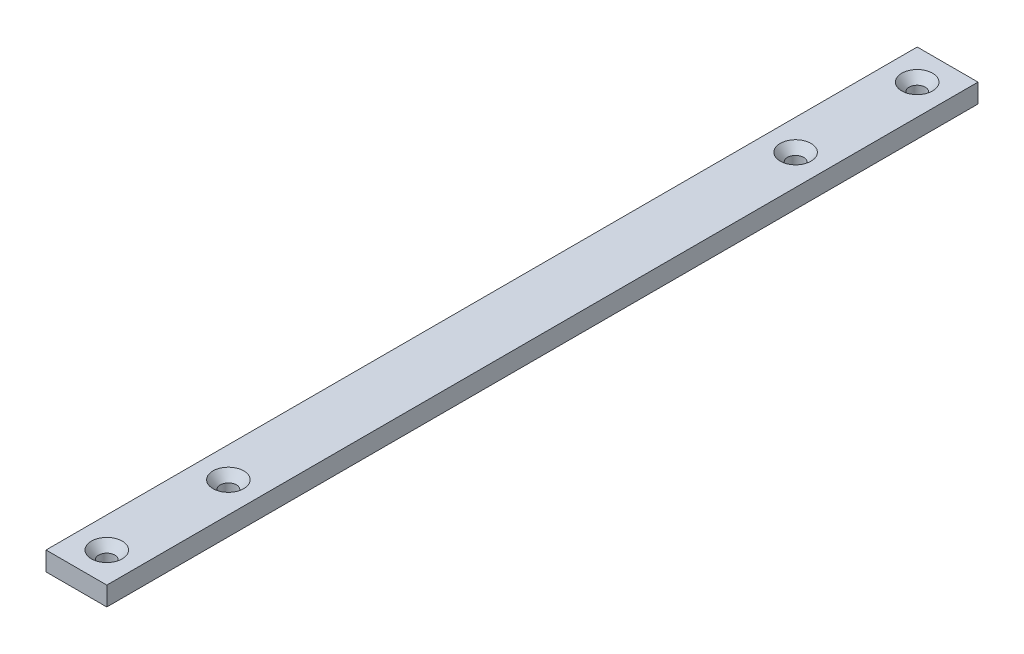
ISO-10303-21;
HEADER;
FILE_DESCRIPTION(('STEP AP214'),'2;1');
FILE_NAME('part.step','',(''),(''),'','','');
FILE_SCHEMA(('AUTOMOTIVE_DESIGN { 1 0 10303 214 1 1 1 1 }'));
ENDSEC;
DATA;
#1=APPLICATION_CONTEXT('core data for automotive mechanical design processes');
#2=APPLICATION_PROTOCOL_DEFINITION('international standard','automotive_design',2000,#1);
#3=PRODUCT_CONTEXT('',#1,'mechanical');
#4=PRODUCT('Part','Part','',(#3));
#5=PRODUCT_RELATED_PRODUCT_CATEGORY('part','',(#4));
#6=PRODUCT_DEFINITION_FORMATION('','',#4);
#7=PRODUCT_DEFINITION_CONTEXT('part definition',#1,'design');
#8=PRODUCT_DEFINITION('design','',#6,#7);
#9=PRODUCT_DEFINITION_SHAPE('','',#8);
#10=(LENGTH_UNIT() NAMED_UNIT(*) SI_UNIT(.MILLI.,.METRE.));
#11=(NAMED_UNIT(*) PLANE_ANGLE_UNIT() SI_UNIT($,.RADIAN.));
#12=(NAMED_UNIT(*) SI_UNIT($,.STERADIAN.) SOLID_ANGLE_UNIT());
#13=UNCERTAINTY_MEASURE_WITH_UNIT(LENGTH_MEASURE(1.E-05),#10,'distance_accuracy_value','');
#14=(GEOMETRIC_REPRESENTATION_CONTEXT(3) GLOBAL_UNCERTAINTY_ASSIGNED_CONTEXT((#13)) GLOBAL_UNIT_ASSIGNED_CONTEXT((#10,
#11,#12)) REPRESENTATION_CONTEXT('',''));
#15=CARTESIAN_POINT('',(0.,0.,0.));
#16=DIRECTION('',(0.,0.,1.));
#17=DIRECTION('',(1.,0.,0.));
#18=AXIS2_PLACEMENT_3D('',#15,#16,#17);
#19=CARTESIAN_POINT('',(-12.7,3.96875,182.));
#20=DIRECTION('',(1.,0.,0.));
#21=DIRECTION('',(0.,0.,-1.));
#22=AXIS2_PLACEMENT_3D('',#19,#20,#21);
#23=PLANE('',#22);
#24=DIRECTION('',(0.,-1.,0.));
#25=VECTOR('',#24,1.);
#26=CARTESIAN_POINT('',(-12.7,3.96875,-182.));
#27=LINE('',#26,#25);
#28=CARTESIAN_POINT('',(-12.7,3.96875,-182.));
#29=VERTEX_POINT('',#28);
#30=CARTESIAN_POINT('',(-12.7,-3.96875,-182.));
#31=VERTEX_POINT('',#30);
#32=EDGE_CURVE('E100',#29,#31,#27,.T.);
#33=ORIENTED_EDGE('',*,*,#32,.T.);
#34=DIRECTION('',(0.,0.,-1.));
#35=VECTOR('',#34,1.);
#36=CARTESIAN_POINT('',(-12.7,-3.96875,182.));
#37=LINE('',#36,#35);
#38=CARTESIAN_POINT('',(-12.7,-3.96875,182.));
#39=VERTEX_POINT('',#38);
#40=EDGE_CURVE('E11',#39,#31,#37,.T.);
#41=ORIENTED_EDGE('',*,*,#40,.F.);
#42=DIRECTION('',(0.,-1.,0.));
#43=VECTOR('',#42,1.);
#44=CARTESIAN_POINT('',(-12.7,3.96875,182.));
#45=LINE('',#44,#43);
#46=CARTESIAN_POINT('',(-12.7,3.96875,182.));
#47=VERTEX_POINT('',#46);
#48=EDGE_CURVE('E88',#47,#39,#45,.T.);
#49=ORIENTED_EDGE('',*,*,#48,.F.);
#50=DIRECTION('',(0.,0.,-1.));
#51=VECTOR('',#50,1.);
#52=CARTESIAN_POINT('',(-12.7,3.96875,182.));
#53=LINE('',#52,#51);
#54=EDGE_CURVE('E96',#47,#29,#53,.T.);
#55=ORIENTED_EDGE('',*,*,#54,.T.);
#56=EDGE_LOOP('',(#33,#41,#49,#55));
#57=FACE_BOUND('',#56,.T.);
#58=ADVANCED_FACE('F37',(#57),#23,.F.);
#59=CARTESIAN_POINT('',(12.7,-3.96875,182.));
#60=DIRECTION('',(0.,1.,0.));
#61=DIRECTION('',(0.,0.,1.));
#62=AXIS2_PLACEMENT_3D('',#59,#60,#61);
#63=PLANE('',#62);
#64=CARTESIAN_POINT('',(0.,-3.96875,-169.3));
#65=DIRECTION('',(0.,1.,0.));
#66=DIRECTION('',(0.,0.,1.));
#67=AXIS2_PLACEMENT_3D('',#64,#65,#66);
#68=CIRCLE('',#67,3.3782);
#69=CARTESIAN_POINT('',(0.,-3.96875,-165.9218));
#70=VERTEX_POINT('',#69);
#71=EDGE_CURVE('E140',#70,#70,#68,.T.);
#72=ORIENTED_EDGE('',*,*,#71,.T.);
#73=EDGE_LOOP('',(#72));
#74=FACE_BOUND('',#73,.T.);
#75=CARTESIAN_POINT('',(0.,-3.96875,169.3));
#76=DIRECTION('',(0.,1.,0.));
#77=DIRECTION('',(0.,0.,1.));
#78=AXIS2_PLACEMENT_3D('',#75,#76,#77);
#79=CIRCLE('',#78,3.3782);
#80=CARTESIAN_POINT('',(0.,-3.96875,172.6782));
#81=VERTEX_POINT('',#80);
#82=EDGE_CURVE('E131',#81,#81,#79,.T.);
#83=ORIENTED_EDGE('',*,*,#82,.T.);
#84=EDGE_LOOP('',(#83));
#85=FACE_BOUND('',#84,.T.);
#86=CARTESIAN_POINT('',(0.,-3.96875,-118.5));
#87=DIRECTION('',(0.,1.,0.));
#88=DIRECTION('',(0.,0.,1.));
#89=AXIS2_PLACEMENT_3D('',#86,#87,#88);
#90=CIRCLE('',#89,3.3782);
#91=CARTESIAN_POINT('',(0.,-3.96875,-115.1218));
#92=VERTEX_POINT('',#91);
#93=EDGE_CURVE('E122',#92,#92,#90,.T.);
#94=ORIENTED_EDGE('',*,*,#93,.T.);
#95=EDGE_LOOP('',(#94));
#96=FACE_BOUND('',#95,.T.);
#97=CARTESIAN_POINT('',(0.,-3.96875,118.5));
#98=DIRECTION('',(0.,1.,0.));
#99=DIRECTION('',(0.,0.,1.));
#100=AXIS2_PLACEMENT_3D('',#97,#98,#99);
#101=CIRCLE('',#100,3.3782);
#102=CARTESIAN_POINT('',(0.,-3.96875,121.8782));
#103=VERTEX_POINT('',#102);
#104=EDGE_CURVE('E103',#103,#103,#101,.T.);
#105=ORIENTED_EDGE('',*,*,#104,.T.);
#106=EDGE_LOOP('',(#105));
#107=FACE_BOUND('',#106,.T.);
#108=DIRECTION('',(1.,0.,0.));
#109=VECTOR('',#108,1.);
#110=CARTESIAN_POINT('',(12.7,-3.96875,-182.));
#111=LINE('',#110,#109);
#112=CARTESIAN_POINT('',(12.7,-3.96875,-182.));
#113=VERTEX_POINT('',#112);
#114=EDGE_CURVE('E92',#31,#113,#111,.T.);
#115=ORIENTED_EDGE('',*,*,#114,.T.);
#116=DIRECTION('',(0.,0.,-1.));
#117=VECTOR('',#116,1.);
#118=CARTESIAN_POINT('',(12.7,-3.96875,182.));
#119=LINE('',#118,#117);
#120=CARTESIAN_POINT('',(12.7,-3.96875,182.));
#121=VERTEX_POINT('',#120);
#122=EDGE_CURVE('E45',#121,#113,#119,.T.);
#123=ORIENTED_EDGE('',*,*,#122,.F.);
#124=DIRECTION('',(1.,0.,0.));
#125=VECTOR('',#124,1.);
#126=CARTESIAN_POINT('',(12.7,-3.96875,182.));
#127=LINE('',#126,#125);
#128=EDGE_CURVE('E83',#39,#121,#127,.T.);
#129=ORIENTED_EDGE('',*,*,#128,.F.);
#130=ORIENTED_EDGE('',*,*,#40,.T.);
#131=EDGE_LOOP('',(#115,#123,#129,#130));
#132=FACE_BOUND('',#131,.T.);
#133=ADVANCED_FACE('F91',(#74,#85,#96,#107,#132),#63,.F.);
#134=CARTESIAN_POINT('',(12.7,3.96875,182.));
#135=DIRECTION('',(-1.,0.,0.));
#136=DIRECTION('',(0.,0.,1.));
#137=AXIS2_PLACEMENT_3D('',#134,#135,#136);
#138=PLANE('',#137);
#139=DIRECTION('',(0.,1.,0.));
#140=VECTOR('',#139,1.);
#141=CARTESIAN_POINT('',(12.7,3.96875,-182.));
#142=LINE('',#141,#140);
#143=CARTESIAN_POINT('',(12.7,3.96875,-182.));
#144=VERTEX_POINT('',#143);
#145=EDGE_CURVE('E70',#113,#144,#142,.T.);
#146=ORIENTED_EDGE('',*,*,#145,.T.);
#147=DIRECTION('',(0.,0.,-1.));
#148=VECTOR('',#147,1.);
#149=CARTESIAN_POINT('',(12.7,3.96875,182.));
#150=LINE('',#149,#148);
#151=CARTESIAN_POINT('',(12.7,3.96875,182.));
#152=VERTEX_POINT('',#151);
#153=EDGE_CURVE('E93',#152,#144,#150,.T.);
#154=ORIENTED_EDGE('',*,*,#153,.F.);
#155=DIRECTION('',(0.,1.,0.));
#156=VECTOR('',#155,1.);
#157=CARTESIAN_POINT('',(12.7,3.96875,182.));
#158=LINE('',#157,#156);
#159=EDGE_CURVE('E86',#121,#152,#158,.T.);
#160=ORIENTED_EDGE('',*,*,#159,.F.);
#161=ORIENTED_EDGE('',*,*,#122,.T.);
#162=EDGE_LOOP('',(#146,#154,#160,#161));
#163=FACE_BOUND('',#162,.T.);
#164=ADVANCED_FACE('F94',(#163),#138,.F.);
#165=CARTESIAN_POINT('',(12.7,3.96875,182.));
#166=DIRECTION('',(0.,-1.,0.));
#167=DIRECTION('',(0.,0.,-1.));
#168=AXIS2_PLACEMENT_3D('',#165,#166,#167);
#169=PLANE('',#168);
#170=CARTESIAN_POINT('',(0.,3.96875,-169.3));
#171=DIRECTION('',(0.,1.,0.));
#172=DIRECTION('',(0.,0.,1.));
#173=AXIS2_PLACEMENT_3D('',#170,#171,#172);
#174=CIRCLE('',#173,6.4389);
#175=CARTESIAN_POINT('',(0.,3.96875,-162.8611));
#176=VERTEX_POINT('',#175);
#177=EDGE_CURVE('E146',#176,#176,#174,.T.);
#178=ORIENTED_EDGE('',*,*,#177,.F.);
#179=EDGE_LOOP('',(#178));
#180=FACE_BOUND('',#179,.T.);
#181=CARTESIAN_POINT('',(0.,3.96875,169.3));
#182=DIRECTION('',(0.,1.,0.));
#183=DIRECTION('',(0.,0.,1.));
#184=AXIS2_PLACEMENT_3D('',#181,#182,#183);
#185=CIRCLE('',#184,6.4389);
#186=CARTESIAN_POINT('',(0.,3.96875,175.7389));
#187=VERTEX_POINT('',#186);
#188=EDGE_CURVE('E137',#187,#187,#185,.T.);
#189=ORIENTED_EDGE('',*,*,#188,.F.);
#190=EDGE_LOOP('',(#189));
#191=FACE_BOUND('',#190,.T.);
#192=CARTESIAN_POINT('',(0.,3.96875,-118.5));
#193=DIRECTION('',(0.,1.,0.));
#194=DIRECTION('',(0.,0.,1.));
#195=AXIS2_PLACEMENT_3D('',#192,#193,#194);
#196=CIRCLE('',#195,6.4389);
#197=CARTESIAN_POINT('',(0.,3.96875,-112.0611));
#198=VERTEX_POINT('',#197);
#199=EDGE_CURVE('E128',#198,#198,#196,.T.);
#200=ORIENTED_EDGE('',*,*,#199,.F.);
#201=EDGE_LOOP('',(#200));
#202=FACE_BOUND('',#201,.T.);
#203=CARTESIAN_POINT('',(0.,3.96875,118.5));
#204=DIRECTION('',(0.,1.,0.));
#205=DIRECTION('',(0.,0.,1.));
#206=AXIS2_PLACEMENT_3D('',#203,#204,#205);
#207=CIRCLE('',#206,6.4389);
#208=CARTESIAN_POINT('',(0.,3.96875,124.9389));
#209=VERTEX_POINT('',#208);
#210=EDGE_CURVE('E119',#209,#209,#207,.T.);
#211=ORIENTED_EDGE('',*,*,#210,.F.);
#212=EDGE_LOOP('',(#211));
#213=FACE_BOUND('',#212,.T.);
#214=DIRECTION('',(-1.,0.,0.));
#215=VECTOR('',#214,1.);
#216=CARTESIAN_POINT('',(12.7,3.96875,-182.));
#217=LINE('',#216,#215);
#218=EDGE_CURVE('E76',#144,#29,#217,.T.);
#219=ORIENTED_EDGE('',*,*,#218,.T.);
#220=ORIENTED_EDGE('',*,*,#54,.F.);
#221=DIRECTION('',(-1.,0.,0.));
#222=VECTOR('',#221,1.);
#223=CARTESIAN_POINT('',(12.7,3.96875,182.));
#224=LINE('',#223,#222);
#225=EDGE_CURVE('E53',#152,#47,#224,.T.);
#226=ORIENTED_EDGE('',*,*,#225,.F.);
#227=ORIENTED_EDGE('',*,*,#153,.T.);
#228=EDGE_LOOP('',(#219,#220,#226,#227));
#229=FACE_BOUND('',#228,.T.);
#230=ADVANCED_FACE('F108',(#180,#191,#202,#213,#229),#169,.F.);
#231=CARTESIAN_POINT('',(0.,0.,182.));
#232=DIRECTION('',(0.,0.,-1.));
#233=DIRECTION('',(-1.,0.,0.));
#234=AXIS2_PLACEMENT_3D('',#231,#232,#233);
#235=PLANE('',#234);
#236=ORIENTED_EDGE('',*,*,#48,.T.);
#237=ORIENTED_EDGE('',*,*,#128,.T.);
#238=ORIENTED_EDGE('',*,*,#159,.T.);
#239=ORIENTED_EDGE('',*,*,#225,.T.);
#240=EDGE_LOOP('',(#236,#237,#238,#239));
#241=FACE_BOUND('',#240,.T.);
#242=ADVANCED_FACE('F84',(#241),#235,.F.);
#243=CARTESIAN_POINT('',(0.,0.,-182.));
#244=DIRECTION('',(0.,0.,-1.));
#245=DIRECTION('',(-1.,0.,0.));
#246=AXIS2_PLACEMENT_3D('',#243,#244,#245);
#247=PLANE('',#246);
#248=ORIENTED_EDGE('',*,*,#32,.F.);
#249=ORIENTED_EDGE('',*,*,#218,.F.);
#250=ORIENTED_EDGE('',*,*,#145,.F.);
#251=ORIENTED_EDGE('',*,*,#114,.F.);
#252=EDGE_LOOP('',(#248,#249,#250,#251));
#253=FACE_BOUND('',#252,.T.);
#254=ADVANCED_FACE('F111',(#253),#247,.T.);
#255=CARTESIAN_POINT('',(0.,3.96875,118.5));
#256=DIRECTION('',(0.,1.,0.));
#257=DIRECTION('',(0.,0.,1.));
#258=AXIS2_PLACEMENT_3D('',#255,#256,#257);
#259=CYLINDRICAL_SURFACE('',#258,3.3782);
#260=ORIENTED_EDGE('',*,*,#104,.F.);
#261=EDGE_LOOP('',(#260));
#262=FACE_BOUND('',#261,.T.);
#263=CARTESIAN_POINT('',(0.,0.447817416018657,118.5));
#264=DIRECTION('',(0.,1.,0.));
#265=DIRECTION('',(0.,0.,1.));
#266=AXIS2_PLACEMENT_3D('',#263,#264,#265);
#267=CIRCLE('',#266,3.3782);
#268=CARTESIAN_POINT('',(0.,0.447817416018657,121.8782));
#269=VERTEX_POINT('',#268);
#270=EDGE_CURVE('E116',#269,#269,#267,.T.);
#271=ORIENTED_EDGE('',*,*,#270,.T.);
#272=EDGE_LOOP('',(#271));
#273=FACE_BOUND('',#272,.T.);
#274=ADVANCED_FACE('F164',(#262,#273),#259,.F.);
#275=CARTESIAN_POINT('',(0.,3.96875,118.5));
#276=DIRECTION('',(0.,1.,0.));
#277=DIRECTION('',(0.,0.,1.));
#278=AXIS2_PLACEMENT_3D('',#275,#276,#277);
#279=CONICAL_SURFACE('',#278,6.4389,0.715584993317675);
#280=ORIENTED_EDGE('',*,*,#270,.F.);
#281=EDGE_LOOP('',(#280));
#282=FACE_BOUND('',#281,.T.);
#283=ORIENTED_EDGE('',*,*,#210,.T.);
#284=EDGE_LOOP('',(#283));
#285=FACE_BOUND('',#284,.T.);
#286=ADVANCED_FACE('F161',(#282,#285),#279,.F.);
#287=CARTESIAN_POINT('',(0.,3.96875,-118.5));
#288=DIRECTION('',(0.,1.,0.));
#289=DIRECTION('',(0.,0.,1.));
#290=AXIS2_PLACEMENT_3D('',#287,#288,#289);
#291=CYLINDRICAL_SURFACE('',#290,3.3782);
#292=ORIENTED_EDGE('',*,*,#93,.F.);
#293=EDGE_LOOP('',(#292));
#294=FACE_BOUND('',#293,.T.);
#295=CARTESIAN_POINT('',(0.,0.447817416018657,-118.5));
#296=DIRECTION('',(0.,1.,0.));
#297=DIRECTION('',(0.,0.,1.));
#298=AXIS2_PLACEMENT_3D('',#295,#296,#297);
#299=CIRCLE('',#298,3.3782);
#300=CARTESIAN_POINT('',(0.,0.447817416018657,-115.1218));
#301=VERTEX_POINT('',#300);
#302=EDGE_CURVE('E125',#301,#301,#299,.T.);
#303=ORIENTED_EDGE('',*,*,#302,.T.);
#304=EDGE_LOOP('',(#303));
#305=FACE_BOUND('',#304,.T.);
#306=ADVANCED_FACE('F163',(#294,#305),#291,.F.);
#307=CARTESIAN_POINT('',(0.,3.96875,-118.5));
#308=DIRECTION('',(0.,1.,0.));
#309=DIRECTION('',(0.,0.,1.));
#310=AXIS2_PLACEMENT_3D('',#307,#308,#309);
#311=CONICAL_SURFACE('',#310,6.4389,0.715584993317675);
#312=ORIENTED_EDGE('',*,*,#302,.F.);
#313=EDGE_LOOP('',(#312));
#314=FACE_BOUND('',#313,.T.);
#315=ORIENTED_EDGE('',*,*,#199,.T.);
#316=EDGE_LOOP('',(#315));
#317=FACE_BOUND('',#316,.T.);
#318=ADVANCED_FACE('F171',(#314,#317),#311,.F.);
#319=CARTESIAN_POINT('',(0.,3.96875,169.3));
#320=DIRECTION('',(0.,1.,0.));
#321=DIRECTION('',(0.,0.,1.));
#322=AXIS2_PLACEMENT_3D('',#319,#320,#321);
#323=CYLINDRICAL_SURFACE('',#322,3.3782);
#324=ORIENTED_EDGE('',*,*,#82,.F.);
#325=EDGE_LOOP('',(#324));
#326=FACE_BOUND('',#325,.T.);
#327=CARTESIAN_POINT('',(0.,0.447817416018657,169.3));
#328=DIRECTION('',(0.,1.,0.));
#329=DIRECTION('',(0.,0.,1.));
#330=AXIS2_PLACEMENT_3D('',#327,#328,#329);
#331=CIRCLE('',#330,3.3782);
#332=CARTESIAN_POINT('',(0.,0.447817416018657,172.6782));
#333=VERTEX_POINT('',#332);
#334=EDGE_CURVE('E134',#333,#333,#331,.T.);
#335=ORIENTED_EDGE('',*,*,#334,.T.);
#336=EDGE_LOOP('',(#335));
#337=FACE_BOUND('',#336,.T.);
#338=ADVANCED_FACE('F225',(#326,#337),#323,.F.);
#339=CARTESIAN_POINT('',(0.,3.96875,169.3));
#340=DIRECTION('',(0.,1.,0.));
#341=DIRECTION('',(0.,0.,1.));
#342=AXIS2_PLACEMENT_3D('',#339,#340,#341);
#343=CONICAL_SURFACE('',#342,6.4389,0.715584993317675);
#344=ORIENTED_EDGE('',*,*,#334,.F.);
#345=EDGE_LOOP('',(#344));
#346=FACE_BOUND('',#345,.T.);
#347=ORIENTED_EDGE('',*,*,#188,.T.);
#348=EDGE_LOOP('',(#347));
#349=FACE_BOUND('',#348,.T.);
#350=ADVANCED_FACE('F235',(#346,#349),#343,.F.);
#351=CARTESIAN_POINT('',(0.,3.96875,-169.3));
#352=DIRECTION('',(0.,1.,0.));
#353=DIRECTION('',(0.,0.,1.));
#354=AXIS2_PLACEMENT_3D('',#351,#352,#353);
#355=CYLINDRICAL_SURFACE('',#354,3.3782);
#356=ORIENTED_EDGE('',*,*,#71,.F.);
#357=EDGE_LOOP('',(#356));
#358=FACE_BOUND('',#357,.T.);
#359=CARTESIAN_POINT('',(0.,0.447817416018657,-169.3));
#360=DIRECTION('',(0.,1.,0.));
#361=DIRECTION('',(0.,0.,1.));
#362=AXIS2_PLACEMENT_3D('',#359,#360,#361);
#363=CIRCLE('',#362,3.3782);
#364=CARTESIAN_POINT('',(0.,0.447817416018657,-165.9218));
#365=VERTEX_POINT('',#364);
#366=EDGE_CURVE('E143',#365,#365,#363,.T.);
#367=ORIENTED_EDGE('',*,*,#366,.T.);
#368=EDGE_LOOP('',(#367));
#369=FACE_BOUND('',#368,.T.);
#370=ADVANCED_FACE('F245',(#358,#369),#355,.F.);
#371=CARTESIAN_POINT('',(0.,3.96875,-169.3));
#372=DIRECTION('',(0.,1.,0.));
#373=DIRECTION('',(0.,0.,1.));
#374=AXIS2_PLACEMENT_3D('',#371,#372,#373);
#375=CONICAL_SURFACE('',#374,6.4389,0.715584993317675);
#376=ORIENTED_EDGE('',*,*,#366,.F.);
#377=EDGE_LOOP('',(#376));
#378=FACE_BOUND('',#377,.T.);
#379=ORIENTED_EDGE('',*,*,#177,.T.);
#380=EDGE_LOOP('',(#379));
#381=FACE_BOUND('',#380,.T.);
#382=ADVANCED_FACE('F150',(#378,#381),#375,.F.);
#383=CLOSED_SHELL('',(#58,#133,#164,#230,#242,#254,#274,#286,#306,#318,#338,#350,#370,#382));
#384=MANIFOLD_SOLID_BREP('B2',#383);
#385=ADVANCED_BREP_SHAPE_REPRESENTATION('',(#18,#384),#14);
#386=SHAPE_DEFINITION_REPRESENTATION(#9,#385);
ENDSEC;
END-ISO-10303-21;
